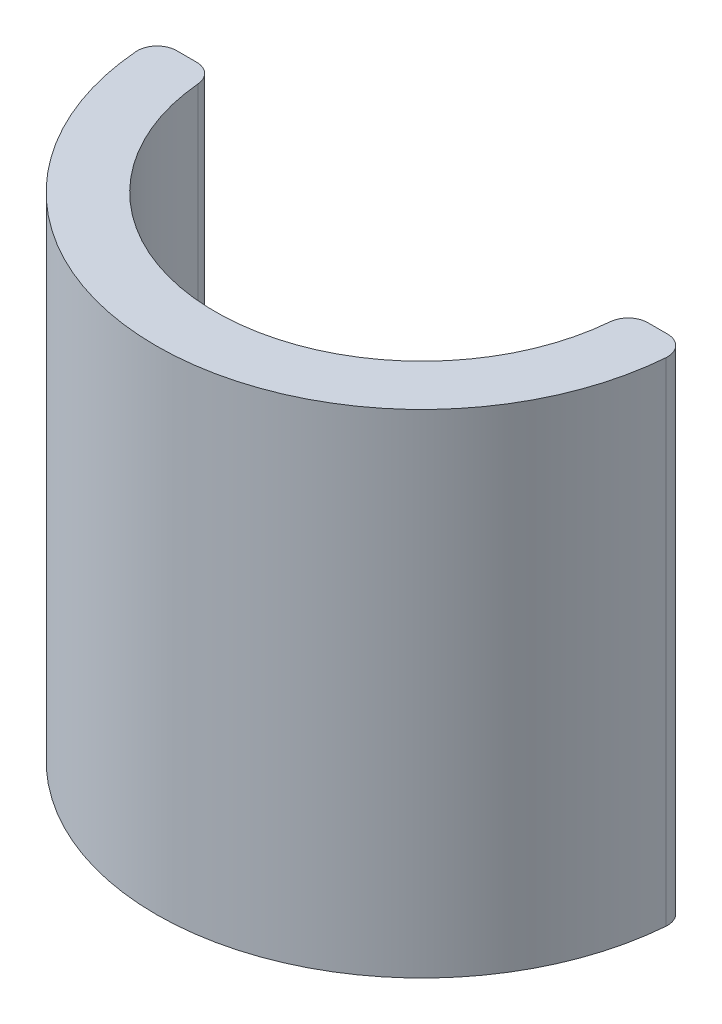
ISO-10303-21;
HEADER;
FILE_DESCRIPTION(('STEP AP214'),'2;1');
FILE_NAME('part.step','',(''),(''),'','','');
FILE_SCHEMA(('AUTOMOTIVE_DESIGN { 1 0 10303 214 1 1 1 1 }'));
ENDSEC;
DATA;
#1=APPLICATION_CONTEXT('core data for automotive mechanical design processes');
#2=APPLICATION_PROTOCOL_DEFINITION('international standard','automotive_design',2000,#1);
#3=PRODUCT_CONTEXT('',#1,'mechanical');
#4=PRODUCT('Part','Part','',(#3));
#5=PRODUCT_RELATED_PRODUCT_CATEGORY('part','',(#4));
#6=PRODUCT_DEFINITION_FORMATION('','',#4);
#7=PRODUCT_DEFINITION_CONTEXT('part definition',#1,'design');
#8=PRODUCT_DEFINITION('design','',#6,#7);
#9=PRODUCT_DEFINITION_SHAPE('','',#8);
#10=(LENGTH_UNIT() NAMED_UNIT(*) SI_UNIT(.MILLI.,.METRE.));
#11=(NAMED_UNIT(*) PLANE_ANGLE_UNIT() SI_UNIT($,.RADIAN.));
#12=(NAMED_UNIT(*) SI_UNIT($,.STERADIAN.) SOLID_ANGLE_UNIT());
#13=UNCERTAINTY_MEASURE_WITH_UNIT(LENGTH_MEASURE(1.E-05),#10,'distance_accuracy_value','');
#14=(GEOMETRIC_REPRESENTATION_CONTEXT(3) GLOBAL_UNCERTAINTY_ASSIGNED_CONTEXT((#13)) GLOBAL_UNIT_ASSIGNED_CONTEXT((#10,
#11,#12)) REPRESENTATION_CONTEXT('',''));
#15=CARTESIAN_POINT('',(0.,0.,0.));
#16=DIRECTION('',(0.,0.,1.));
#17=DIRECTION('',(1.,0.,0.));
#18=AXIS2_PLACEMENT_3D('',#15,#16,#17);
#19=CARTESIAN_POINT('',(-11.4564392373896,25.,1.));
#20=DIRECTION('',(0.,-1.,0.));
#21=DIRECTION('',(0.,0.,-1.));
#22=AXIS2_PLACEMENT_3D('',#19,#20,#21);
#23=CYLINDRICAL_SURFACE('',#22,1.);
#24=CARTESIAN_POINT('',(-11.4564392373896,0.,1.));
#25=DIRECTION('',(0.,1.,0.));
#26=DIRECTION('',(0.,0.,-1.));
#27=AXIS2_PLACEMENT_3D('',#24,#25,#26);
#28=CIRCLE('',#27,1.);
#29=CARTESIAN_POINT('',(-10.4602271297905,0.,0.913043478260869));
#30=VERTEX_POINT('',#29);
#31=CARTESIAN_POINT('',(-11.4564392373896,0.,0.));
#32=VERTEX_POINT('',#31);
#33=EDGE_CURVE('E123',#30,#32,#28,.T.);
#34=ORIENTED_EDGE('',*,*,#33,.T.);
#35=DIRECTION('',(0.,-1.,0.));
#36=VECTOR('',#35,1.);
#37=CARTESIAN_POINT('',(-11.4564392373896,25.,0.));
#38=LINE('',#37,#36);
#39=CARTESIAN_POINT('',(-11.4564392373896,25.,0.));
#40=VERTEX_POINT('',#39);
#41=EDGE_CURVE('E106',#40,#32,#38,.T.);
#42=ORIENTED_EDGE('',*,*,#41,.F.);
#43=CARTESIAN_POINT('',(-11.4564392373896,25.,1.));
#44=DIRECTION('',(0.,1.,0.));
#45=DIRECTION('',(0.,0.,-1.));
#46=AXIS2_PLACEMENT_3D('',#43,#44,#45);
#47=CIRCLE('',#46,1.);
#48=CARTESIAN_POINT('',(-10.4602271297905,25.,0.913043478260869));
#49=VERTEX_POINT('',#48);
#50=EDGE_CURVE('E112',#49,#40,#47,.T.);
#51=ORIENTED_EDGE('',*,*,#50,.F.);
#52=DIRECTION('',(0.,-1.,0.));
#53=VECTOR('',#52,1.);
#54=CARTESIAN_POINT('',(-10.4602271297905,25.,0.913043478260869));
#55=LINE('',#54,#53);
#56=EDGE_CURVE('E169',#49,#30,#55,.T.);
#57=ORIENTED_EDGE('',*,*,#56,.T.);
#58=EDGE_LOOP('',(#34,#42,#51,#57));
#59=FACE_BOUND('',#58,.T.);
#60=ADVANCED_FACE('F34',(#59),#23,.T.);
#61=CARTESIAN_POINT('',(-12.4599357943771,25.,0.));
#62=DIRECTION('',(0.,0.,1.));
#63=DIRECTION('',(1.,0.,0.));
#64=AXIS2_PLACEMENT_3D('',#61,#62,#63);
#65=PLANE('',#64);
#66=DIRECTION('',(-1.,0.,0.));
#67=VECTOR('',#66,1.);
#68=CARTESIAN_POINT('',(-12.4599357943771,0.,0.));
#69=LINE('',#68,#67);
#70=CARTESIAN_POINT('',(-12.4599357943771,0.,0.));
#71=VERTEX_POINT('',#70);
#72=EDGE_CURVE('E164',#32,#71,#69,.T.);
#73=ORIENTED_EDGE('',*,*,#72,.T.);
#74=DIRECTION('',(0.,-1.,0.));
#75=VECTOR('',#74,1.);
#76=CARTESIAN_POINT('',(-12.4599357943771,25.,0.));
#77=LINE('',#76,#75);
#78=CARTESIAN_POINT('',(-12.4599357943771,25.,0.));
#79=VERTEX_POINT('',#78);
#80=EDGE_CURVE('E109',#79,#71,#77,.T.);
#81=ORIENTED_EDGE('',*,*,#80,.F.);
#82=DIRECTION('',(-1.,0.,0.));
#83=VECTOR('',#82,1.);
#84=CARTESIAN_POINT('',(-12.4599357943771,25.,0.));
#85=LINE('',#84,#83);
#86=EDGE_CURVE('E102',#40,#79,#85,.T.);
#87=ORIENTED_EDGE('',*,*,#86,.F.);
#88=ORIENTED_EDGE('',*,*,#41,.T.);
#89=EDGE_LOOP('',(#73,#81,#87,#88));
#90=FACE_BOUND('',#89,.T.);
#91=ADVANCED_FACE('F104',(#90),#65,.F.);
#92=CARTESIAN_POINT('',(-12.4599357943771,25.,1.));
#93=DIRECTION('',(0.,-1.,0.));
#94=DIRECTION('',(0.,0.,-1.));
#95=AXIS2_PLACEMENT_3D('',#92,#93,#94);
#96=CYLINDRICAL_SURFACE('',#95,0.999999999999999);
#97=CARTESIAN_POINT('',(-12.4599357943771,0.,1.));
#98=DIRECTION('',(0.,1.,0.));
#99=DIRECTION('',(0.,0.,-1.));
#100=AXIS2_PLACEMENT_3D('',#97,#98,#99);
#101=CIRCLE('',#100,0.999999999999999);
#102=CARTESIAN_POINT('',(-13.4567306579273,0.,1.08));
#103=VERTEX_POINT('',#102);
#104=EDGE_CURVE('E161',#71,#103,#101,.T.);
#105=ORIENTED_EDGE('',*,*,#104,.T.);
#106=DIRECTION('',(0.,-1.,0.));
#107=VECTOR('',#106,1.);
#108=CARTESIAN_POINT('',(-13.4567306579273,25.,1.08));
#109=LINE('',#108,#107);
#110=CARTESIAN_POINT('',(-13.4567306579273,25.,1.08));
#111=VERTEX_POINT('',#110);
#112=EDGE_CURVE('E128',#111,#103,#109,.T.);
#113=ORIENTED_EDGE('',*,*,#112,.F.);
#114=CARTESIAN_POINT('',(-12.4599357943771,25.,1.));
#115=DIRECTION('',(0.,1.,0.));
#116=DIRECTION('',(0.,0.,-1.));
#117=AXIS2_PLACEMENT_3D('',#114,#115,#116);
#118=CIRCLE('',#117,0.999999999999999);
#119=EDGE_CURVE('E111',#79,#111,#118,.T.);
#120=ORIENTED_EDGE('',*,*,#119,.F.);
#121=ORIENTED_EDGE('',*,*,#80,.T.);
#122=EDGE_LOOP('',(#105,#113,#120,#121));
#123=FACE_BOUND('',#122,.T.);
#124=ADVANCED_FACE('F174',(#123),#96,.T.);
#125=CARTESIAN_POINT('',(0.,25.,0.));
#126=DIRECTION('',(0.,-1.,0.));
#127=DIRECTION('',(0.,0.,-1.));
#128=AXIS2_PLACEMENT_3D('',#125,#126,#127);
#129=CYLINDRICAL_SURFACE('',#128,13.5);
#130=CARTESIAN_POINT('',(0.,0.,0.));
#131=DIRECTION('',(0.,1.,0.));
#132=DIRECTION('',(0.,0.,1.));
#133=AXIS2_PLACEMENT_3D('',#130,#131,#132);
#134=CIRCLE('',#133,13.5);
#135=CARTESIAN_POINT('',(13.4567306579273,0.,1.08));
#136=VERTEX_POINT('',#135);
#137=EDGE_CURVE('E156',#103,#136,#134,.T.);
#138=ORIENTED_EDGE('',*,*,#137,.T.);
#139=DIRECTION('',(0.,-1.,0.));
#140=VECTOR('',#139,1.);
#141=CARTESIAN_POINT('',(13.4567306579273,25.,1.08));
#142=LINE('',#141,#140);
#143=CARTESIAN_POINT('',(13.4567306579273,25.,1.08));
#144=VERTEX_POINT('',#143);
#145=EDGE_CURVE('E57',#136,#144,#142,.F.);
#146=ORIENTED_EDGE('',*,*,#145,.T.);
#147=CARTESIAN_POINT('',(0.,25.,0.));
#148=DIRECTION('',(0.,1.,0.));
#149=DIRECTION('',(0.,0.,1.));
#150=AXIS2_PLACEMENT_3D('',#147,#148,#149);
#151=CIRCLE('',#150,13.5);
#152=EDGE_CURVE('E142',#111,#144,#151,.T.);
#153=ORIENTED_EDGE('',*,*,#152,.F.);
#154=ORIENTED_EDGE('',*,*,#112,.T.);
#155=EDGE_LOOP('',(#138,#146,#153,#154));
#156=FACE_BOUND('',#155,.T.);
#157=ADVANCED_FACE('F159',(#156),#129,.T.);
#158=CARTESIAN_POINT('',(13.5,25.,0.));
#159=DIRECTION('',(0.,0.,1.));
#160=DIRECTION('',(1.,0.,0.));
#161=AXIS2_PLACEMENT_3D('',#158,#159,#160);
#162=PLANE('',#161);
#163=DIRECTION('',(-1.,0.,0.));
#164=VECTOR('',#163,1.);
#165=CARTESIAN_POINT('',(13.5,25.,0.));
#166=LINE('',#165,#164);
#167=CARTESIAN_POINT('',(12.4599357943771,25.,0.));
#168=VERTEX_POINT('',#167);
#169=CARTESIAN_POINT('',(11.4564392373896,25.,0.));
#170=VERTEX_POINT('',#169);
#171=EDGE_CURVE('E141',#168,#170,#166,.T.);
#172=ORIENTED_EDGE('',*,*,#171,.F.);
#173=DIRECTION('',(0.,-1.,0.));
#174=VECTOR('',#173,1.);
#175=CARTESIAN_POINT('',(12.4599357943771,25.,0.));
#176=LINE('',#175,#174);
#177=CARTESIAN_POINT('',(12.4599357943771,0.,0.));
#178=VERTEX_POINT('',#177);
#179=EDGE_CURVE('E126',#168,#178,#176,.T.);
#180=ORIENTED_EDGE('',*,*,#179,.T.);
#181=DIRECTION('',(-1.,0.,0.));
#182=VECTOR('',#181,1.);
#183=CARTESIAN_POINT('',(13.5,0.,0.));
#184=LINE('',#183,#182);
#185=CARTESIAN_POINT('',(11.4564392373896,0.,0.));
#186=VERTEX_POINT('',#185);
#187=EDGE_CURVE('E157',#178,#186,#184,.T.);
#188=ORIENTED_EDGE('',*,*,#187,.T.);
#189=DIRECTION('',(0.,-1.,0.));
#190=VECTOR('',#189,1.);
#191=CARTESIAN_POINT('',(11.4564392373896,25.,0.));
#192=LINE('',#191,#190);
#193=EDGE_CURVE('E124',#186,#170,#192,.F.);
#194=ORIENTED_EDGE('',*,*,#193,.T.);
#195=EDGE_LOOP('',(#172,#180,#188,#194));
#196=FACE_BOUND('',#195,.T.);
#197=ADVANCED_FACE('F146',(#196),#162,.F.);
#198=CARTESIAN_POINT('',(0.,25.,0.));
#199=DIRECTION('',(0.,-1.,0.));
#200=DIRECTION('',(0.,0.,-1.));
#201=AXIS2_PLACEMENT_3D('',#198,#199,#200);
#202=CYLINDRICAL_SURFACE('',#201,10.5);
#203=CARTESIAN_POINT('',(0.,25.,0.));
#204=DIRECTION('',(0.,-1.,0.));
#205=DIRECTION('',(0.,0.,1.));
#206=AXIS2_PLACEMENT_3D('',#203,#204,#205);
#207=CIRCLE('',#206,10.5);
#208=CARTESIAN_POINT('',(10.4602271297905,25.,0.91304347826087));
#209=VERTEX_POINT('',#208);
#210=EDGE_CURVE('E116',#209,#49,#207,.T.);
#211=ORIENTED_EDGE('',*,*,#210,.F.);
#212=DIRECTION('',(0.,-1.,0.));
#213=VECTOR('',#212,1.);
#214=CARTESIAN_POINT('',(10.4602271297905,25.,0.91304347826087));
#215=LINE('',#214,#213);
#216=CARTESIAN_POINT('',(10.4602271297905,0.,0.91304347826087));
#217=VERTEX_POINT('',#216);
#218=EDGE_CURVE('E11',#209,#217,#215,.T.);
#219=ORIENTED_EDGE('',*,*,#218,.T.);
#220=CARTESIAN_POINT('',(0.,0.,0.));
#221=DIRECTION('',(0.,-1.,0.));
#222=DIRECTION('',(0.,0.,1.));
#223=AXIS2_PLACEMENT_3D('',#220,#221,#222);
#224=CIRCLE('',#223,10.5);
#225=EDGE_CURVE('E120',#217,#30,#224,.T.);
#226=ORIENTED_EDGE('',*,*,#225,.T.);
#227=ORIENTED_EDGE('',*,*,#56,.F.);
#228=EDGE_LOOP('',(#211,#219,#226,#227));
#229=FACE_BOUND('',#228,.T.);
#230=ADVANCED_FACE('F198',(#229),#202,.F.);
#231=CARTESIAN_POINT('',(-11.4564392373896,25.,1.));
#232=DIRECTION('',(0.,-1.,0.));
#233=DIRECTION('',(0.,0.,-1.));
#234=AXIS2_PLACEMENT_3D('',#231,#232,#233);
#235=PLANE('',#234);
#236=ORIENTED_EDGE('',*,*,#152,.T.);
#237=CARTESIAN_POINT('',(12.4599357943771,25.,1.));
#238=DIRECTION('',(0.,-1.,0.));
#239=DIRECTION('',(0.,0.,-1.));
#240=AXIS2_PLACEMENT_3D('',#237,#238,#239);
#241=CIRCLE('',#240,1.);
#242=EDGE_CURVE('E42',#144,#168,#241,.F.);
#243=ORIENTED_EDGE('',*,*,#242,.T.);
#244=ORIENTED_EDGE('',*,*,#171,.T.);
#245=CARTESIAN_POINT('',(11.4564392373896,25.,1.));
#246=DIRECTION('',(0.,-1.,0.));
#247=DIRECTION('',(0.,0.,-1.));
#248=AXIS2_PLACEMENT_3D('',#245,#246,#247);
#249=CIRCLE('',#248,1.);
#250=EDGE_CURVE('E49',#170,#209,#249,.F.);
#251=ORIENTED_EDGE('',*,*,#250,.T.);
#252=ORIENTED_EDGE('',*,*,#210,.T.);
#253=ORIENTED_EDGE('',*,*,#50,.T.);
#254=ORIENTED_EDGE('',*,*,#86,.T.);
#255=ORIENTED_EDGE('',*,*,#119,.T.);
#256=EDGE_LOOP('',(#236,#243,#244,#251,#252,#253,#254,#255));
#257=FACE_BOUND('',#256,.T.);
#258=ADVANCED_FACE('F115',(#257),#235,.F.);
#259=CARTESIAN_POINT('',(-11.4564392373896,0.,1.));
#260=DIRECTION('',(0.,-1.,0.));
#261=DIRECTION('',(0.,0.,-1.));
#262=AXIS2_PLACEMENT_3D('',#259,#260,#261);
#263=PLANE('',#262);
#264=ORIENTED_EDGE('',*,*,#187,.F.);
#265=CARTESIAN_POINT('',(12.4599357943771,0.,1.));
#266=DIRECTION('',(0.,-1.,0.));
#267=DIRECTION('',(0.,0.,-1.));
#268=AXIS2_PLACEMENT_3D('',#265,#266,#267);
#269=CIRCLE('',#268,1.);
#270=EDGE_CURVE('E136',#178,#136,#269,.T.);
#271=ORIENTED_EDGE('',*,*,#270,.T.);
#272=ORIENTED_EDGE('',*,*,#137,.F.);
#273=ORIENTED_EDGE('',*,*,#104,.F.);
#274=ORIENTED_EDGE('',*,*,#72,.F.);
#275=ORIENTED_EDGE('',*,*,#33,.F.);
#276=ORIENTED_EDGE('',*,*,#225,.F.);
#277=CARTESIAN_POINT('',(11.4564392373896,0.,1.));
#278=DIRECTION('',(0.,-1.,0.));
#279=DIRECTION('',(0.,0.,-1.));
#280=AXIS2_PLACEMENT_3D('',#277,#278,#279);
#281=CIRCLE('',#280,1.);
#282=EDGE_CURVE('E134',#217,#186,#281,.T.);
#283=ORIENTED_EDGE('',*,*,#282,.T.);
#284=EDGE_LOOP('',(#264,#271,#272,#273,#274,#275,#276,#283));
#285=FACE_BOUND('',#284,.T.);
#286=ADVANCED_FACE('F154',(#285),#263,.T.);
#287=CARTESIAN_POINT('',(12.4599357943771,25.,1.));
#288=DIRECTION('',(0.,-1.,0.));
#289=DIRECTION('',(0.,0.,-1.));
#290=AXIS2_PLACEMENT_3D('',#287,#288,#289);
#291=CYLINDRICAL_SURFACE('',#290,1.);
#292=ORIENTED_EDGE('',*,*,#242,.F.);
#293=ORIENTED_EDGE('',*,*,#145,.F.);
#294=ORIENTED_EDGE('',*,*,#270,.F.);
#295=ORIENTED_EDGE('',*,*,#179,.F.);
#296=EDGE_LOOP('',(#292,#293,#294,#295));
#297=FACE_BOUND('',#296,.T.);
#298=ADVANCED_FACE('F151',(#297),#291,.T.);
#299=CARTESIAN_POINT('',(11.4564392373896,25.,1.));
#300=DIRECTION('',(0.,-1.,0.));
#301=DIRECTION('',(0.,0.,-1.));
#302=AXIS2_PLACEMENT_3D('',#299,#300,#301);
#303=CYLINDRICAL_SURFACE('',#302,1.);
#304=ORIENTED_EDGE('',*,*,#250,.F.);
#305=ORIENTED_EDGE('',*,*,#193,.F.);
#306=ORIENTED_EDGE('',*,*,#282,.F.);
#307=ORIENTED_EDGE('',*,*,#218,.F.);
#308=EDGE_LOOP('',(#304,#305,#306,#307));
#309=FACE_BOUND('',#308,.T.);
#310=ADVANCED_FACE('F36',(#309),#303,.T.);
#311=CLOSED_SHELL('',(#60,#91,#124,#157,#197,#230,#258,#286,#298,#310));
#312=MANIFOLD_SOLID_BREP('B2',#311);
#313=ADVANCED_BREP_SHAPE_REPRESENTATION('',(#18,#312),#14);
#314=SHAPE_DEFINITION_REPRESENTATION(#9,#313);
ENDSEC;
END-ISO-10303-21;
